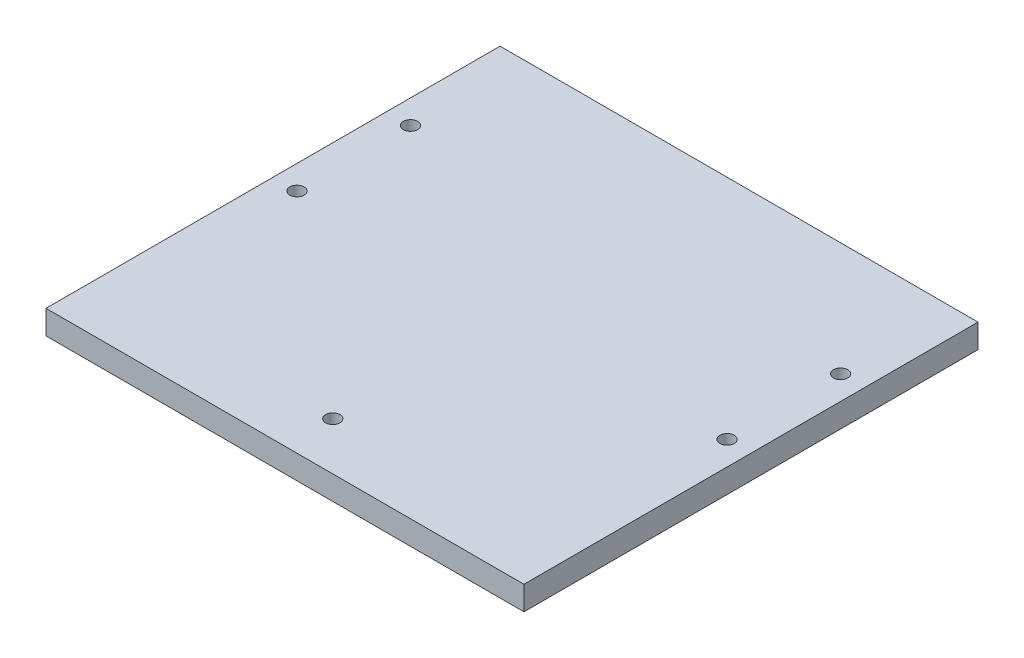
ISO-10303-21;
HEADER;
FILE_DESCRIPTION(('STEP AP214'),'2;1');
FILE_NAME('part.step','',(''),(''),'','','');
FILE_SCHEMA(('AUTOMOTIVE_DESIGN { 1 0 10303 214 1 1 1 1 }'));
ENDSEC;
DATA;
#1=APPLICATION_CONTEXT('core data for automotive mechanical design processes');
#2=APPLICATION_PROTOCOL_DEFINITION('international standard','automotive_design',2000,#1);
#3=PRODUCT_CONTEXT('',#1,'mechanical');
#4=PRODUCT('Part','Part','',(#3));
#5=PRODUCT_RELATED_PRODUCT_CATEGORY('part','',(#4));
#6=PRODUCT_DEFINITION_FORMATION('','',#4);
#7=PRODUCT_DEFINITION_CONTEXT('part definition',#1,'design');
#8=PRODUCT_DEFINITION('design','',#6,#7);
#9=PRODUCT_DEFINITION_SHAPE('','',#8);
#10=(LENGTH_UNIT() NAMED_UNIT(*) SI_UNIT(.MILLI.,.METRE.));
#11=(NAMED_UNIT(*) PLANE_ANGLE_UNIT() SI_UNIT($,.RADIAN.));
#12=(NAMED_UNIT(*) SI_UNIT($,.STERADIAN.) SOLID_ANGLE_UNIT());
#13=UNCERTAINTY_MEASURE_WITH_UNIT(LENGTH_MEASURE(1.E-05),#10,'distance_accuracy_value','');
#14=(GEOMETRIC_REPRESENTATION_CONTEXT(3) GLOBAL_UNCERTAINTY_ASSIGNED_CONTEXT((#13)) GLOBAL_UNIT_ASSIGNED_CONTEXT((#10,
#11,#12)) REPRESENTATION_CONTEXT('',''));
#15=CARTESIAN_POINT('',(0.,0.,0.));
#16=DIRECTION('',(0.,0.,1.));
#17=DIRECTION('',(1.,0.,0.));
#18=AXIS2_PLACEMENT_3D('',#15,#16,#17);
#19=CARTESIAN_POINT('',(0.,10.,-190.));
#20=DIRECTION('',(0.,0.,1.));
#21=DIRECTION('',(1.,0.,0.));
#22=AXIS2_PLACEMENT_3D('',#19,#20,#21);
#23=PLANE('',#22);
#24=DIRECTION('',(1.,0.,0.));
#25=VECTOR('',#24,1.);
#26=CARTESIAN_POINT('',(62.,2.,-190.));
#27=LINE('',#26,#25);
#28=CARTESIAN_POINT('',(62.,2.,-190.));
#29=VERTEX_POINT('',#28);
#30=CARTESIAN_POINT('',(82.,2.,-190.));
#31=VERTEX_POINT('',#30);
#32=EDGE_CURVE('E57',#29,#31,#27,.T.);
#33=ORIENTED_EDGE('',*,*,#32,.T.);
#34=DIRECTION('',(0.,-1.,0.));
#35=VECTOR('',#34,1.);
#36=CARTESIAN_POINT('',(82.,9.,-190.));
#37=LINE('',#36,#35);
#38=CARTESIAN_POINT('',(82.,9.,-190.));
#39=VERTEX_POINT('',#38);
#40=EDGE_CURVE('E229',#39,#31,#37,.T.);
#41=ORIENTED_EDGE('',*,*,#40,.F.);
#42=DIRECTION('',(1.,0.,0.));
#43=VECTOR('',#42,1.);
#44=CARTESIAN_POINT('',(62.,9.,-190.));
#45=LINE('',#44,#43);
#46=CARTESIAN_POINT('',(62.,9.,-190.));
#47=VERTEX_POINT('',#46);
#48=EDGE_CURVE('E225',#47,#39,#45,.T.);
#49=ORIENTED_EDGE('',*,*,#48,.F.);
#50=DIRECTION('',(0.,-1.,0.));
#51=VECTOR('',#50,1.);
#52=CARTESIAN_POINT('',(62.,9.,-190.));
#53=LINE('',#52,#51);
#54=EDGE_CURVE('E222',#47,#29,#53,.T.);
#55=ORIENTED_EDGE('',*,*,#54,.T.);
#56=EDGE_LOOP('',(#33,#41,#49,#55));
#57=FACE_BOUND('',#56,.T.);
#58=DIRECTION('',(-1.,0.,0.));
#59=VECTOR('',#58,1.);
#60=CARTESIAN_POINT('',(138.,2.,-190.));
#61=LINE('',#60,#59);
#62=CARTESIAN_POINT('',(138.,2.,-190.));
#63=VERTEX_POINT('',#62);
#64=CARTESIAN_POINT('',(118.,2.,-190.));
#65=VERTEX_POINT('',#64);
#66=EDGE_CURVE('E259',#63,#65,#61,.T.);
#67=ORIENTED_EDGE('',*,*,#66,.F.);
#68=DIRECTION('',(0.,-1.,0.));
#69=VECTOR('',#68,1.);
#70=CARTESIAN_POINT('',(138.,8.99999999999999,-190.));
#71=LINE('',#70,#69);
#72=CARTESIAN_POINT('',(138.,8.99999999999999,-190.));
#73=VERTEX_POINT('',#72);
#74=EDGE_CURVE('E215',#73,#63,#71,.T.);
#75=ORIENTED_EDGE('',*,*,#74,.F.);
#76=DIRECTION('',(-1.,0.,0.));
#77=VECTOR('',#76,1.);
#78=CARTESIAN_POINT('',(138.,8.99999999999999,-190.));
#79=LINE('',#78,#77);
#80=CARTESIAN_POINT('',(118.,9.,-190.));
#81=VERTEX_POINT('',#80);
#82=EDGE_CURVE('E252',#73,#81,#79,.T.);
#83=ORIENTED_EDGE('',*,*,#82,.T.);
#84=DIRECTION('',(0.,-1.,0.));
#85=VECTOR('',#84,1.);
#86=CARTESIAN_POINT('',(118.,9.,-190.));
#87=LINE('',#86,#85);
#88=EDGE_CURVE('E255',#81,#65,#87,.T.);
#89=ORIENTED_EDGE('',*,*,#88,.T.);
#90=EDGE_LOOP('',(#67,#75,#83,#89));
#91=FACE_BOUND('',#90,.T.);
#92=DIRECTION('',(-1.,0.,0.));
#93=VECTOR('',#92,1.);
#94=CARTESIAN_POINT('',(178.,1.99999999999998,-190.));
#95=LINE('',#94,#93);
#96=CARTESIAN_POINT('',(178.,1.99999999999998,-190.));
#97=VERTEX_POINT('',#96);
#98=CARTESIAN_POINT('',(162.,1.99999999999999,-190.));
#99=VERTEX_POINT('',#98);
#100=EDGE_CURVE('E289',#97,#99,#95,.T.);
#101=ORIENTED_EDGE('',*,*,#100,.F.);
#102=DIRECTION('',(0.,-1.,0.));
#103=VECTOR('',#102,1.);
#104=CARTESIAN_POINT('',(178.,7.99999999999999,-190.));
#105=LINE('',#104,#103);
#106=CARTESIAN_POINT('',(178.,7.99999999999999,-190.));
#107=VERTEX_POINT('',#106);
#108=EDGE_CURVE('E251',#107,#97,#105,.T.);
#109=ORIENTED_EDGE('',*,*,#108,.F.);
#110=DIRECTION('',(-1.,0.,0.));
#111=VECTOR('',#110,1.);
#112=CARTESIAN_POINT('',(178.,7.99999999999999,-190.));
#113=LINE('',#112,#111);
#114=CARTESIAN_POINT('',(162.,8.,-190.));
#115=VERTEX_POINT('',#114);
#116=EDGE_CURVE('E282',#107,#115,#113,.T.);
#117=ORIENTED_EDGE('',*,*,#116,.T.);
#118=DIRECTION('',(0.,-1.,0.));
#119=VECTOR('',#118,1.);
#120=CARTESIAN_POINT('',(162.,8.,-190.));
#121=LINE('',#120,#119);
#122=EDGE_CURVE('E285',#115,#99,#121,.T.);
#123=ORIENTED_EDGE('',*,*,#122,.T.);
#124=EDGE_LOOP('',(#101,#109,#117,#123));
#125=FACE_BOUND('',#124,.T.);
#126=DIRECTION('',(-1.,0.,0.));
#127=VECTOR('',#126,1.);
#128=CARTESIAN_POINT('',(0.,0.,-190.));
#129=LINE('',#128,#127);
#130=CARTESIAN_POINT('',(200.,0.,-190.));
#131=VERTEX_POINT('',#130);
#132=CARTESIAN_POINT('',(0.,0.,-190.));
#133=VERTEX_POINT('',#132);
#134=EDGE_CURVE('E305',#131,#133,#129,.T.);
#135=ORIENTED_EDGE('',*,*,#134,.T.);
#136=DIRECTION('',(0.,-1.,0.));
#137=VECTOR('',#136,1.);
#138=CARTESIAN_POINT('',(0.,10.,-190.));
#139=LINE('',#138,#137);
#140=CARTESIAN_POINT('',(0.,10.,-190.));
#141=VERTEX_POINT('',#140);
#142=EDGE_CURVE('E311',#141,#133,#139,.T.);
#143=ORIENTED_EDGE('',*,*,#142,.F.);
#144=DIRECTION('',(-1.,0.,0.));
#145=VECTOR('',#144,1.);
#146=CARTESIAN_POINT('',(0.,10.,-190.));
#147=LINE('',#146,#145);
#148=CARTESIAN_POINT('',(200.,10.,-190.));
#149=VERTEX_POINT('',#148);
#150=EDGE_CURVE('E309',#149,#141,#147,.T.);
#151=ORIENTED_EDGE('',*,*,#150,.F.);
#152=DIRECTION('',(0.,-1.,0.));
#153=VECTOR('',#152,1.);
#154=CARTESIAN_POINT('',(200.,10.,-190.));
#155=LINE('',#154,#153);
#156=EDGE_CURVE('E321',#149,#131,#155,.T.);
#157=ORIENTED_EDGE('',*,*,#156,.T.);
#158=EDGE_LOOP('',(#135,#143,#151,#157));
#159=FACE_BOUND('',#158,.T.);
#160=DIRECTION('',(1.,0.,0.));
#161=VECTOR('',#160,1.);
#162=CARTESIAN_POINT('',(22.,2.,-190.));
#163=LINE('',#162,#161);
#164=CARTESIAN_POINT('',(22.,2.,-190.));
#165=VERTEX_POINT('',#164);
#166=CARTESIAN_POINT('',(38.,2.,-190.));
#167=VERTEX_POINT('',#166);
#168=EDGE_CURVE('E49',#165,#167,#163,.T.);
#169=ORIENTED_EDGE('',*,*,#168,.T.);
#170=DIRECTION('',(0.,-1.,0.));
#171=VECTOR('',#170,1.);
#172=CARTESIAN_POINT('',(38.,8.00000000000001,-190.));
#173=LINE('',#172,#171);
#174=CARTESIAN_POINT('',(38.,8.00000000000001,-190.));
#175=VERTEX_POINT('',#174);
#176=EDGE_CURVE('E188',#175,#167,#173,.T.);
#177=ORIENTED_EDGE('',*,*,#176,.F.);
#178=DIRECTION('',(1.,0.,0.));
#179=VECTOR('',#178,1.);
#180=CARTESIAN_POINT('',(22.,8.00000000000001,-190.));
#181=LINE('',#180,#179);
#182=CARTESIAN_POINT('',(22.,8.00000000000001,-190.));
#183=VERTEX_POINT('',#182);
#184=EDGE_CURVE('E203',#183,#175,#181,.T.);
#185=ORIENTED_EDGE('',*,*,#184,.F.);
#186=DIRECTION('',(0.,-1.,0.));
#187=VECTOR('',#186,1.);
#188=CARTESIAN_POINT('',(22.,8.00000000000001,-190.));
#189=LINE('',#188,#187);
#190=EDGE_CURVE('E181',#183,#165,#189,.T.);
#191=ORIENTED_EDGE('',*,*,#190,.T.);
#192=EDGE_LOOP('',(#169,#177,#185,#191));
#193=FACE_BOUND('',#192,.T.);
#194=ADVANCED_FACE('F34',(#57,#91,#125,#159,#193),#23,.F.);
#195=CARTESIAN_POINT('',(0.,10.,0.));
#196=DIRECTION('',(1.,0.,0.));
#197=DIRECTION('',(0.,0.,-1.));
#198=AXIS2_PLACEMENT_3D('',#195,#196,#197);
#199=PLANE('',#198);
#200=DIRECTION('',(0.,0.,1.));
#201=VECTOR('',#200,1.);
#202=CARTESIAN_POINT('',(0.,0.,0.));
#203=LINE('',#202,#201);
#204=CARTESIAN_POINT('',(0.,0.,0.));
#205=VERTEX_POINT('',#204);
#206=EDGE_CURVE('E189',#133,#205,#203,.T.);
#207=ORIENTED_EDGE('',*,*,#206,.T.);
#208=DIRECTION('',(0.,-1.,0.));
#209=VECTOR('',#208,1.);
#210=CARTESIAN_POINT('',(0.,10.,0.));
#211=LINE('',#210,#209);
#212=CARTESIAN_POINT('',(0.,10.,0.));
#213=VERTEX_POINT('',#212);
#214=EDGE_CURVE('E11',#213,#205,#211,.T.);
#215=ORIENTED_EDGE('',*,*,#214,.F.);
#216=DIRECTION('',(0.,0.,1.));
#217=VECTOR('',#216,1.);
#218=CARTESIAN_POINT('',(0.,10.,0.));
#219=LINE('',#218,#217);
#220=EDGE_CURVE('E301',#141,#213,#219,.T.);
#221=ORIENTED_EDGE('',*,*,#220,.F.);
#222=ORIENTED_EDGE('',*,*,#142,.T.);
#223=EDGE_LOOP('',(#207,#215,#221,#222));
#224=FACE_BOUND('',#223,.T.);
#225=ADVANCED_FACE('F36',(#224),#199,.F.);
#226=CARTESIAN_POINT('',(0.,10.,0.));
#227=DIRECTION('',(0.,0.,-1.));
#228=DIRECTION('',(-1.,0.,0.));
#229=AXIS2_PLACEMENT_3D('',#226,#227,#228);
#230=PLANE('',#229);
#231=DIRECTION('',(1.,0.,0.));
#232=VECTOR('',#231,1.);
#233=CARTESIAN_POINT('',(0.,0.,0.));
#234=LINE('',#233,#232);
#235=CARTESIAN_POINT('',(200.,0.,0.));
#236=VERTEX_POINT('',#235);
#237=EDGE_CURVE('E314',#205,#236,#234,.T.);
#238=ORIENTED_EDGE('',*,*,#237,.T.);
#239=DIRECTION('',(0.,-1.,0.));
#240=VECTOR('',#239,1.);
#241=CARTESIAN_POINT('',(200.,10.,0.));
#242=LINE('',#241,#240);
#243=CARTESIAN_POINT('',(200.,10.,0.));
#244=VERTEX_POINT('',#243);
#245=EDGE_CURVE('E42',#244,#236,#242,.T.);
#246=ORIENTED_EDGE('',*,*,#245,.F.);
#247=DIRECTION('',(1.,0.,0.));
#248=VECTOR('',#247,1.);
#249=CARTESIAN_POINT('',(0.,10.,0.));
#250=LINE('',#249,#248);
#251=EDGE_CURVE('E304',#213,#244,#250,.T.);
#252=ORIENTED_EDGE('',*,*,#251,.F.);
#253=ORIENTED_EDGE('',*,*,#214,.T.);
#254=EDGE_LOOP('',(#238,#246,#252,#253));
#255=FACE_BOUND('',#254,.T.);
#256=ADVANCED_FACE('F344',(#255),#230,.F.);
#257=CARTESIAN_POINT('',(200.,10.,0.));
#258=DIRECTION('',(-1.,0.,0.));
#259=DIRECTION('',(0.,0.,1.));
#260=AXIS2_PLACEMENT_3D('',#257,#258,#259);
#261=PLANE('',#260);
#262=DIRECTION('',(0.,0.,-1.));
#263=VECTOR('',#262,1.);
#264=CARTESIAN_POINT('',(200.,0.,0.));
#265=LINE('',#264,#263);
#266=EDGE_CURVE('E316',#236,#131,#265,.T.);
#267=ORIENTED_EDGE('',*,*,#266,.T.);
#268=ORIENTED_EDGE('',*,*,#156,.F.);
#269=DIRECTION('',(0.,0.,-1.));
#270=VECTOR('',#269,1.);
#271=CARTESIAN_POINT('',(200.,10.,0.));
#272=LINE('',#271,#270);
#273=EDGE_CURVE('E307',#244,#149,#272,.T.);
#274=ORIENTED_EDGE('',*,*,#273,.F.);
#275=ORIENTED_EDGE('',*,*,#245,.T.);
#276=EDGE_LOOP('',(#267,#268,#274,#275));
#277=FACE_BOUND('',#276,.T.);
#278=ADVANCED_FACE('F328',(#277),#261,.F.);
#279=CARTESIAN_POINT('',(0.,10.,0.));
#280=DIRECTION('',(0.,-1.,0.));
#281=DIRECTION('',(0.,0.,-1.));
#282=AXIS2_PLACEMENT_3D('',#279,#280,#281);
#283=PLANE('',#282);
#284=CARTESIAN_POINT('',(100.,10.,-20.));
#285=DIRECTION('',(0.,1.,0.));
#286=DIRECTION('',(0.,0.,1.));
#287=AXIS2_PLACEMENT_3D('',#284,#285,#286);
#288=CIRCLE('',#287,3.00000000000001);
#289=CARTESIAN_POINT('',(100.,10.,-17.));
#290=VERTEX_POINT('',#289);
#291=EDGE_CURVE('E464',#290,#290,#288,.T.);
#292=ORIENTED_EDGE('',*,*,#291,.F.);
#293=EDGE_LOOP('',(#292));
#294=FACE_BOUND('',#293,.T.);
#295=CARTESIAN_POINT('',(190.,10.,-142.5));
#296=DIRECTION('',(0.,-1.,0.));
#297=DIRECTION('',(0.,0.,1.));
#298=AXIS2_PLACEMENT_3D('',#295,#296,#297);
#299=CIRCLE('',#298,2.99999999999997);
#300=CARTESIAN_POINT('',(190.,10.,-139.5));
#301=VERTEX_POINT('',#300);
#302=EDGE_CURVE('E482',#301,#301,#299,.T.);
#303=ORIENTED_EDGE('',*,*,#302,.T.);
#304=EDGE_LOOP('',(#303));
#305=FACE_BOUND('',#304,.T.);
#306=CARTESIAN_POINT('',(190.,10.,-95.));
#307=DIRECTION('',(0.,-1.,0.));
#308=DIRECTION('',(0.,0.,1.));
#309=AXIS2_PLACEMENT_3D('',#306,#307,#308);
#310=CIRCLE('',#309,2.99999999999996);
#311=CARTESIAN_POINT('',(190.,10.,-92.));
#312=VERTEX_POINT('',#311);
#313=EDGE_CURVE('E476',#312,#312,#310,.T.);
#314=ORIENTED_EDGE('',*,*,#313,.T.);
#315=EDGE_LOOP('',(#314));
#316=FACE_BOUND('',#315,.T.);
#317=CARTESIAN_POINT('',(10.,10.,-95.));
#318=DIRECTION('',(0.,-1.,0.));
#319=DIRECTION('',(0.,0.,-1.));
#320=AXIS2_PLACEMENT_3D('',#317,#318,#319);
#321=CIRCLE('',#320,3.);
#322=CARTESIAN_POINT('',(10.,10.,-98.));
#323=VERTEX_POINT('',#322);
#324=EDGE_CURVE('E469',#323,#323,#321,.T.);
#325=ORIENTED_EDGE('',*,*,#324,.T.);
#326=EDGE_LOOP('',(#325));
#327=FACE_BOUND('',#326,.T.);
#328=CARTESIAN_POINT('',(10.,10.,-142.5));
#329=DIRECTION('',(0.,-1.,0.));
#330=DIRECTION('',(0.,0.,-1.));
#331=AXIS2_PLACEMENT_3D('',#328,#329,#330);
#332=CIRCLE('',#331,3.);
#333=CARTESIAN_POINT('',(10.,10.,-145.5));
#334=VERTEX_POINT('',#333);
#335=EDGE_CURVE('E281',#334,#334,#332,.T.);
#336=ORIENTED_EDGE('',*,*,#335,.T.);
#337=EDGE_LOOP('',(#336));
#338=FACE_BOUND('',#337,.T.);
#339=ORIENTED_EDGE('',*,*,#220,.T.);
#340=ORIENTED_EDGE('',*,*,#251,.T.);
#341=ORIENTED_EDGE('',*,*,#273,.T.);
#342=ORIENTED_EDGE('',*,*,#150,.T.);
#343=EDGE_LOOP('',(#339,#340,#341,#342));
#344=FACE_BOUND('',#343,.T.);
#345=ADVANCED_FACE('F343',(#294,#305,#316,#327,#338,#344),#283,.F.);
#346=CARTESIAN_POINT('',(0.,0.,0.));
#347=DIRECTION('',(0.,-1.,0.));
#348=DIRECTION('',(0.,0.,-1.));
#349=AXIS2_PLACEMENT_3D('',#346,#347,#348);
#350=PLANE('',#349);
#351=CARTESIAN_POINT('',(100.,0.,-20.));
#352=DIRECTION('',(0.,1.,0.));
#353=DIRECTION('',(0.,0.,1.));
#354=AXIS2_PLACEMENT_3D('',#351,#352,#353);
#355=CIRCLE('',#354,3.00000000000001);
#356=CARTESIAN_POINT('',(100.,0.,-17.));
#357=VERTEX_POINT('',#356);
#358=EDGE_CURVE('E461',#357,#357,#355,.T.);
#359=ORIENTED_EDGE('',*,*,#358,.T.);
#360=EDGE_LOOP('',(#359));
#361=FACE_BOUND('',#360,.T.);
#362=CARTESIAN_POINT('',(190.,0.,-142.5));
#363=DIRECTION('',(0.,-1.,0.));
#364=DIRECTION('',(0.,0.,1.));
#365=AXIS2_PLACEMENT_3D('',#362,#363,#364);
#366=CIRCLE('',#365,2.99999999999997);
#367=CARTESIAN_POINT('',(190.,0.,-139.5));
#368=VERTEX_POINT('',#367);
#369=EDGE_CURVE('E466',#368,#368,#366,.T.);
#370=ORIENTED_EDGE('',*,*,#369,.F.);
#371=EDGE_LOOP('',(#370));
#372=FACE_BOUND('',#371,.T.);
#373=CARTESIAN_POINT('',(190.,0.,-95.));
#374=DIRECTION('',(0.,-1.,0.));
#375=DIRECTION('',(0.,0.,1.));
#376=AXIS2_PLACEMENT_3D('',#373,#374,#375);
#377=CIRCLE('',#376,2.99999999999996);
#378=CARTESIAN_POINT('',(190.,0.,-92.));
#379=VERTEX_POINT('',#378);
#380=EDGE_CURVE('E479',#379,#379,#377,.T.);
#381=ORIENTED_EDGE('',*,*,#380,.F.);
#382=EDGE_LOOP('',(#381));
#383=FACE_BOUND('',#382,.T.);
#384=CARTESIAN_POINT('',(10.,0.,-95.));
#385=DIRECTION('',(0.,-1.,0.));
#386=DIRECTION('',(0.,0.,-1.));
#387=AXIS2_PLACEMENT_3D('',#384,#385,#386);
#388=CIRCLE('',#387,3.);
#389=CARTESIAN_POINT('',(10.,0.,-98.));
#390=VERTEX_POINT('',#389);
#391=EDGE_CURVE('E473',#390,#390,#388,.T.);
#392=ORIENTED_EDGE('',*,*,#391,.F.);
#393=EDGE_LOOP('',(#392));
#394=FACE_BOUND('',#393,.T.);
#395=CARTESIAN_POINT('',(10.,0.,-142.5));
#396=DIRECTION('',(0.,-1.,0.));
#397=DIRECTION('',(0.,0.,-1.));
#398=AXIS2_PLACEMENT_3D('',#395,#396,#397);
#399=CIRCLE('',#398,3.);
#400=CARTESIAN_POINT('',(10.,0.,-145.5));
#401=VERTEX_POINT('',#400);
#402=EDGE_CURVE('E472',#401,#401,#399,.T.);
#403=ORIENTED_EDGE('',*,*,#402,.F.);
#404=EDGE_LOOP('',(#403));
#405=FACE_BOUND('',#404,.T.);
#406=ORIENTED_EDGE('',*,*,#206,.F.);
#407=ORIENTED_EDGE('',*,*,#134,.F.);
#408=ORIENTED_EDGE('',*,*,#266,.F.);
#409=ORIENTED_EDGE('',*,*,#237,.F.);
#410=EDGE_LOOP('',(#406,#407,#408,#409));
#411=FACE_BOUND('',#410,.T.);
#412=ADVANCED_FACE('F334',(#361,#372,#383,#394,#405,#411),#350,.T.);
#413=CARTESIAN_POINT('',(178.,7.99999999999999,-180.));
#414=DIRECTION('',(1.,0.,0.));
#415=DIRECTION('',(0.,0.,-1.));
#416=AXIS2_PLACEMENT_3D('',#413,#414,#415);
#417=PLANE('',#416);
#418=ORIENTED_EDGE('',*,*,#108,.T.);
#419=DIRECTION('',(0.,0.,-1.));
#420=VECTOR('',#419,1.);
#421=CARTESIAN_POINT('',(178.,1.99999999999998,-180.));
#422=LINE('',#421,#420);
#423=CARTESIAN_POINT('',(178.,1.99999999999998,-180.));
#424=VERTEX_POINT('',#423);
#425=EDGE_CURVE('E271',#424,#97,#422,.T.);
#426=ORIENTED_EDGE('',*,*,#425,.F.);
#427=DIRECTION('',(0.,-1.,0.));
#428=VECTOR('',#427,1.);
#429=CARTESIAN_POINT('',(178.,7.99999999999999,-180.));
#430=LINE('',#429,#428);
#431=CARTESIAN_POINT('',(178.,7.99999999999999,-180.));
#432=VERTEX_POINT('',#431);
#433=EDGE_CURVE('E286',#432,#424,#430,.T.);
#434=ORIENTED_EDGE('',*,*,#433,.F.);
#435=DIRECTION('',(0.,0.,-1.));
#436=VECTOR('',#435,1.);
#437=CARTESIAN_POINT('',(178.,7.99999999999999,-180.));
#438=LINE('',#437,#436);
#439=EDGE_CURVE('E279',#432,#107,#438,.T.);
#440=ORIENTED_EDGE('',*,*,#439,.T.);
#441=EDGE_LOOP('',(#418,#426,#434,#440));
#442=FACE_BOUND('',#441,.T.);
#443=ADVANCED_FACE('F360',(#442),#417,.F.);
#444=CARTESIAN_POINT('',(178.,7.99999999999999,-180.));
#445=DIRECTION('',(0.,-1.,0.));
#446=DIRECTION('',(1.,0.,0.));
#447=AXIS2_PLACEMENT_3D('',#444,#445,#446);
#448=PLANE('',#447);
#449=ORIENTED_EDGE('',*,*,#116,.F.);
#450=ORIENTED_EDGE('',*,*,#439,.F.);
#451=DIRECTION('',(-1.,0.,0.));
#452=VECTOR('',#451,1.);
#453=CARTESIAN_POINT('',(178.,7.99999999999999,-180.));
#454=LINE('',#453,#452);
#455=CARTESIAN_POINT('',(162.,8.,-180.));
#456=VERTEX_POINT('',#455);
#457=EDGE_CURVE('E274',#432,#456,#454,.T.);
#458=ORIENTED_EDGE('',*,*,#457,.T.);
#459=DIRECTION('',(0.,0.,-1.));
#460=VECTOR('',#459,1.);
#461=CARTESIAN_POINT('',(162.,8.,-180.));
#462=LINE('',#461,#460);
#463=EDGE_CURVE('E277',#456,#115,#462,.T.);
#464=ORIENTED_EDGE('',*,*,#463,.T.);
#465=EDGE_LOOP('',(#449,#450,#458,#464));
#466=FACE_BOUND('',#465,.T.);
#467=ADVANCED_FACE('F371',(#466),#448,.T.);
#468=CARTESIAN_POINT('',(162.,8.,-180.));
#469=DIRECTION('',(1.,0.,0.));
#470=DIRECTION('',(0.,0.,-1.));
#471=AXIS2_PLACEMENT_3D('',#468,#469,#470);
#472=PLANE('',#471);
#473=ORIENTED_EDGE('',*,*,#122,.F.);
#474=ORIENTED_EDGE('',*,*,#463,.F.);
#475=DIRECTION('',(0.,-1.,0.));
#476=VECTOR('',#475,1.);
#477=CARTESIAN_POINT('',(162.,8.,-180.));
#478=LINE('',#477,#476);
#479=CARTESIAN_POINT('',(162.,1.99999999999999,-180.));
#480=VERTEX_POINT('',#479);
#481=EDGE_CURVE('E294',#456,#480,#478,.T.);
#482=ORIENTED_EDGE('',*,*,#481,.T.);
#483=DIRECTION('',(0.,0.,-1.));
#484=VECTOR('',#483,1.);
#485=CARTESIAN_POINT('',(162.,1.99999999999999,-180.));
#486=LINE('',#485,#484);
#487=EDGE_CURVE('E275',#480,#99,#486,.T.);
#488=ORIENTED_EDGE('',*,*,#487,.T.);
#489=EDGE_LOOP('',(#473,#474,#482,#488));
#490=FACE_BOUND('',#489,.T.);
#491=ADVANCED_FACE('F374',(#490),#472,.T.);
#492=CARTESIAN_POINT('',(178.,1.99999999999998,-180.));
#493=DIRECTION('',(0.,-1.,0.));
#494=DIRECTION('',(1.,0.,0.));
#495=AXIS2_PLACEMENT_3D('',#492,#493,#494);
#496=PLANE('',#495);
#497=ORIENTED_EDGE('',*,*,#100,.T.);
#498=ORIENTED_EDGE('',*,*,#487,.F.);
#499=DIRECTION('',(-1.,0.,0.));
#500=VECTOR('',#499,1.);
#501=CARTESIAN_POINT('',(178.,1.99999999999998,-180.));
#502=LINE('',#501,#500);
#503=EDGE_CURVE('E296',#424,#480,#502,.T.);
#504=ORIENTED_EDGE('',*,*,#503,.F.);
#505=ORIENTED_EDGE('',*,*,#425,.T.);
#506=EDGE_LOOP('',(#497,#498,#504,#505));
#507=FACE_BOUND('',#506,.T.);
#508=ADVANCED_FACE('F369',(#507),#496,.F.);
#509=CARTESIAN_POINT('',(0.,0.,-180.));
#510=DIRECTION('',(0.,0.,-1.));
#511=DIRECTION('',(-1.,0.,0.));
#512=AXIS2_PLACEMENT_3D('',#509,#510,#511);
#513=PLANE('',#512);
#514=ORIENTED_EDGE('',*,*,#433,.T.);
#515=ORIENTED_EDGE('',*,*,#503,.T.);
#516=ORIENTED_EDGE('',*,*,#481,.F.);
#517=ORIENTED_EDGE('',*,*,#457,.F.);
#518=EDGE_LOOP('',(#514,#515,#516,#517));
#519=FACE_BOUND('',#518,.T.);
#520=ADVANCED_FACE('F365',(#519),#513,.T.);
#521=CARTESIAN_POINT('',(138.,8.99999999999999,-180.));
#522=DIRECTION('',(1.,0.,0.));
#523=DIRECTION('',(0.,0.,-1.));
#524=AXIS2_PLACEMENT_3D('',#521,#522,#523);
#525=PLANE('',#524);
#526=ORIENTED_EDGE('',*,*,#74,.T.);
#527=DIRECTION('',(0.,0.,-1.));
#528=VECTOR('',#527,1.);
#529=CARTESIAN_POINT('',(138.,2.,-180.));
#530=LINE('',#529,#528);
#531=CARTESIAN_POINT('',(138.,2.,-180.));
#532=VERTEX_POINT('',#531);
#533=EDGE_CURVE('E241',#532,#63,#530,.T.);
#534=ORIENTED_EDGE('',*,*,#533,.F.);
#535=DIRECTION('',(0.,-1.,0.));
#536=VECTOR('',#535,1.);
#537=CARTESIAN_POINT('',(138.,8.99999999999999,-180.));
#538=LINE('',#537,#536);
#539=CARTESIAN_POINT('',(138.,8.99999999999999,-180.));
#540=VERTEX_POINT('',#539);
#541=EDGE_CURVE('E256',#540,#532,#538,.T.);
#542=ORIENTED_EDGE('',*,*,#541,.F.);
#543=DIRECTION('',(0.,0.,-1.));
#544=VECTOR('',#543,1.);
#545=CARTESIAN_POINT('',(138.,8.99999999999999,-180.));
#546=LINE('',#545,#544);
#547=EDGE_CURVE('E249',#540,#73,#546,.T.);
#548=ORIENTED_EDGE('',*,*,#547,.T.);
#549=EDGE_LOOP('',(#526,#534,#542,#548));
#550=FACE_BOUND('',#549,.T.);
#551=ADVANCED_FACE('F368',(#550),#525,.F.);
#552=CARTESIAN_POINT('',(138.,8.99999999999999,-180.));
#553=DIRECTION('',(0.,-1.,0.));
#554=DIRECTION('',(1.,0.,0.));
#555=AXIS2_PLACEMENT_3D('',#552,#553,#554);
#556=PLANE('',#555);
#557=ORIENTED_EDGE('',*,*,#82,.F.);
#558=ORIENTED_EDGE('',*,*,#547,.F.);
#559=DIRECTION('',(-1.,0.,0.));
#560=VECTOR('',#559,1.);
#561=CARTESIAN_POINT('',(138.,8.99999999999999,-180.));
#562=LINE('',#561,#560);
#563=CARTESIAN_POINT('',(118.,9.,-180.));
#564=VERTEX_POINT('',#563);
#565=EDGE_CURVE('E244',#540,#564,#562,.T.);
#566=ORIENTED_EDGE('',*,*,#565,.T.);
#567=DIRECTION('',(0.,0.,-1.));
#568=VECTOR('',#567,1.);
#569=CARTESIAN_POINT('',(118.,9.,-180.));
#570=LINE('',#569,#568);
#571=EDGE_CURVE('E247',#564,#81,#570,.T.);
#572=ORIENTED_EDGE('',*,*,#571,.T.);
#573=EDGE_LOOP('',(#557,#558,#566,#572));
#574=FACE_BOUND('',#573,.T.);
#575=ADVANCED_FACE('F391',(#574),#556,.T.);
#576=CARTESIAN_POINT('',(118.,9.,-180.));
#577=DIRECTION('',(1.,0.,0.));
#578=DIRECTION('',(0.,0.,-1.));
#579=AXIS2_PLACEMENT_3D('',#576,#577,#578);
#580=PLANE('',#579);
#581=ORIENTED_EDGE('',*,*,#88,.F.);
#582=ORIENTED_EDGE('',*,*,#571,.F.);
#583=DIRECTION('',(0.,-1.,0.));
#584=VECTOR('',#583,1.);
#585=CARTESIAN_POINT('',(118.,9.,-180.));
#586=LINE('',#585,#584);
#587=CARTESIAN_POINT('',(118.,2.,-180.));
#588=VERTEX_POINT('',#587);
#589=EDGE_CURVE('E264',#564,#588,#586,.T.);
#590=ORIENTED_EDGE('',*,*,#589,.T.);
#591=DIRECTION('',(0.,0.,-1.));
#592=VECTOR('',#591,1.);
#593=CARTESIAN_POINT('',(118.,2.,-180.));
#594=LINE('',#593,#592);
#595=EDGE_CURVE('E245',#588,#65,#594,.T.);
#596=ORIENTED_EDGE('',*,*,#595,.T.);
#597=EDGE_LOOP('',(#581,#582,#590,#596));
#598=FACE_BOUND('',#597,.T.);
#599=ADVANCED_FACE('F394',(#598),#580,.T.);
#600=CARTESIAN_POINT('',(138.,2.,-180.));
#601=DIRECTION('',(0.,-1.,0.));
#602=DIRECTION('',(1.,0.,0.));
#603=AXIS2_PLACEMENT_3D('',#600,#601,#602);
#604=PLANE('',#603);
#605=ORIENTED_EDGE('',*,*,#66,.T.);
#606=ORIENTED_EDGE('',*,*,#595,.F.);
#607=DIRECTION('',(-1.,0.,0.));
#608=VECTOR('',#607,1.);
#609=CARTESIAN_POINT('',(138.,2.,-180.));
#610=LINE('',#609,#608);
#611=EDGE_CURVE('E266',#532,#588,#610,.T.);
#612=ORIENTED_EDGE('',*,*,#611,.F.);
#613=ORIENTED_EDGE('',*,*,#533,.T.);
#614=EDGE_LOOP('',(#605,#606,#612,#613));
#615=FACE_BOUND('',#614,.T.);
#616=ADVANCED_FACE('F389',(#615),#604,.F.);
#617=CARTESIAN_POINT('',(0.,0.,-180.));
#618=DIRECTION('',(0.,0.,-1.));
#619=DIRECTION('',(-1.,0.,0.));
#620=AXIS2_PLACEMENT_3D('',#617,#618,#619);
#621=PLANE('',#620);
#622=ORIENTED_EDGE('',*,*,#541,.T.);
#623=ORIENTED_EDGE('',*,*,#611,.T.);
#624=ORIENTED_EDGE('',*,*,#589,.F.);
#625=ORIENTED_EDGE('',*,*,#565,.F.);
#626=EDGE_LOOP('',(#622,#623,#624,#625));
#627=FACE_BOUND('',#626,.T.);
#628=ADVANCED_FACE('F385',(#627),#621,.T.);
#629=CARTESIAN_POINT('',(62.,2.,-180.));
#630=DIRECTION('',(0.,1.,0.));
#631=DIRECTION('',(-1.,0.,0.));
#632=AXIS2_PLACEMENT_3D('',#629,#630,#631);
#633=PLANE('',#632);
#634=ORIENTED_EDGE('',*,*,#32,.F.);
#635=DIRECTION('',(0.,0.,-1.));
#636=VECTOR('',#635,1.);
#637=CARTESIAN_POINT('',(62.,2.,-180.));
#638=LINE('',#637,#636);
#639=CARTESIAN_POINT('',(62.,2.,-180.));
#640=VERTEX_POINT('',#639);
#641=EDGE_CURVE('E219',#640,#29,#638,.T.);
#642=ORIENTED_EDGE('',*,*,#641,.F.);
#643=DIRECTION('',(1.,0.,0.));
#644=VECTOR('',#643,1.);
#645=CARTESIAN_POINT('',(62.,2.,-180.));
#646=LINE('',#645,#644);
#647=CARTESIAN_POINT('',(82.,2.,-180.));
#648=VERTEX_POINT('',#647);
#649=EDGE_CURVE('E226',#640,#648,#646,.T.);
#650=ORIENTED_EDGE('',*,*,#649,.T.);
#651=DIRECTION('',(0.,0.,-1.));
#652=VECTOR('',#651,1.);
#653=CARTESIAN_POINT('',(82.,2.,-180.));
#654=LINE('',#653,#652);
#655=EDGE_CURVE('E212',#648,#31,#654,.T.);
#656=ORIENTED_EDGE('',*,*,#655,.T.);
#657=EDGE_LOOP('',(#634,#642,#650,#656));
#658=FACE_BOUND('',#657,.T.);
#659=ADVANCED_FACE('F388',(#658),#633,.T.);
#660=CARTESIAN_POINT('',(82.,9.,-180.));
#661=DIRECTION('',(1.,0.,0.));
#662=DIRECTION('',(0.,0.,-1.));
#663=AXIS2_PLACEMENT_3D('',#660,#661,#662);
#664=PLANE('',#663);
#665=ORIENTED_EDGE('',*,*,#40,.T.);
#666=ORIENTED_EDGE('',*,*,#655,.F.);
#667=DIRECTION('',(0.,-1.,0.));
#668=VECTOR('',#667,1.);
#669=CARTESIAN_POINT('',(82.,9.,-180.));
#670=LINE('',#669,#668);
#671=CARTESIAN_POINT('',(82.,9.,-180.));
#672=VERTEX_POINT('',#671);
#673=EDGE_CURVE('E237',#672,#648,#670,.T.);
#674=ORIENTED_EDGE('',*,*,#673,.F.);
#675=DIRECTION('',(0.,0.,-1.));
#676=VECTOR('',#675,1.);
#677=CARTESIAN_POINT('',(82.,9.,-180.));
#678=LINE('',#677,#676);
#679=EDGE_CURVE('E214',#672,#39,#678,.T.);
#680=ORIENTED_EDGE('',*,*,#679,.T.);
#681=EDGE_LOOP('',(#665,#666,#674,#680));
#682=FACE_BOUND('',#681,.T.);
#683=ADVANCED_FACE('F416',(#682),#664,.F.);
#684=CARTESIAN_POINT('',(62.,9.,-180.));
#685=DIRECTION('',(0.,1.,0.));
#686=DIRECTION('',(-1.,0.,0.));
#687=AXIS2_PLACEMENT_3D('',#684,#685,#686);
#688=PLANE('',#687);
#689=ORIENTED_EDGE('',*,*,#48,.T.);
#690=ORIENTED_EDGE('',*,*,#679,.F.);
#691=DIRECTION('',(1.,0.,0.));
#692=VECTOR('',#691,1.);
#693=CARTESIAN_POINT('',(62.,9.,-180.));
#694=LINE('',#693,#692);
#695=CARTESIAN_POINT('',(62.,9.,-180.));
#696=VERTEX_POINT('',#695);
#697=EDGE_CURVE('E234',#696,#672,#694,.T.);
#698=ORIENTED_EDGE('',*,*,#697,.F.);
#699=DIRECTION('',(0.,0.,-1.));
#700=VECTOR('',#699,1.);
#701=CARTESIAN_POINT('',(62.,9.,-180.));
#702=LINE('',#701,#700);
#703=EDGE_CURVE('E217',#696,#47,#702,.T.);
#704=ORIENTED_EDGE('',*,*,#703,.T.);
#705=EDGE_LOOP('',(#689,#690,#698,#704));
#706=FACE_BOUND('',#705,.T.);
#707=ADVANCED_FACE('F412',(#706),#688,.F.);
#708=CARTESIAN_POINT('',(62.,9.,-180.));
#709=DIRECTION('',(1.,0.,0.));
#710=DIRECTION('',(0.,0.,-1.));
#711=AXIS2_PLACEMENT_3D('',#708,#709,#710);
#712=PLANE('',#711);
#713=ORIENTED_EDGE('',*,*,#54,.F.);
#714=ORIENTED_EDGE('',*,*,#703,.F.);
#715=DIRECTION('',(0.,-1.,0.));
#716=VECTOR('',#715,1.);
#717=CARTESIAN_POINT('',(62.,9.,-180.));
#718=LINE('',#717,#716);
#719=EDGE_CURVE('E221',#696,#640,#718,.T.);
#720=ORIENTED_EDGE('',*,*,#719,.T.);
#721=ORIENTED_EDGE('',*,*,#641,.T.);
#722=EDGE_LOOP('',(#713,#714,#720,#721));
#723=FACE_BOUND('',#722,.T.);
#724=ADVANCED_FACE('F408',(#723),#712,.T.);
#725=CARTESIAN_POINT('',(0.,0.,-180.));
#726=DIRECTION('',(0.,0.,-1.));
#727=DIRECTION('',(-1.,0.,0.));
#728=AXIS2_PLACEMENT_3D('',#725,#726,#727);
#729=PLANE('',#728);
#730=ORIENTED_EDGE('',*,*,#649,.F.);
#731=ORIENTED_EDGE('',*,*,#719,.F.);
#732=ORIENTED_EDGE('',*,*,#697,.T.);
#733=ORIENTED_EDGE('',*,*,#673,.T.);
#734=EDGE_LOOP('',(#730,#731,#732,#733));
#735=FACE_BOUND('',#734,.T.);
#736=ADVANCED_FACE('F405',(#735),#729,.T.);
#737=CARTESIAN_POINT('',(22.,2.,-180.));
#738=DIRECTION('',(0.,1.,0.));
#739=DIRECTION('',(-1.,0.,0.));
#740=AXIS2_PLACEMENT_3D('',#737,#738,#739);
#741=PLANE('',#740);
#742=ORIENTED_EDGE('',*,*,#168,.F.);
#743=DIRECTION('',(0.,0.,-1.));
#744=VECTOR('',#743,1.);
#745=CARTESIAN_POINT('',(22.,2.,-180.));
#746=LINE('',#745,#744);
#747=CARTESIAN_POINT('',(22.,2.,-180.));
#748=VERTEX_POINT('',#747);
#749=EDGE_CURVE('E176',#748,#165,#746,.T.);
#750=ORIENTED_EDGE('',*,*,#749,.F.);
#751=DIRECTION('',(1.,0.,0.));
#752=VECTOR('',#751,1.);
#753=CARTESIAN_POINT('',(22.,2.,-180.));
#754=LINE('',#753,#752);
#755=CARTESIAN_POINT('',(38.,2.,-180.));
#756=VERTEX_POINT('',#755);
#757=EDGE_CURVE('E171',#748,#756,#754,.T.);
#758=ORIENTED_EDGE('',*,*,#757,.T.);
#759=DIRECTION('',(0.,0.,-1.));
#760=VECTOR('',#759,1.);
#761=CARTESIAN_POINT('',(38.,2.,-180.));
#762=LINE('',#761,#760);
#763=EDGE_CURVE('E174',#756,#167,#762,.T.);
#764=ORIENTED_EDGE('',*,*,#763,.T.);
#765=EDGE_LOOP('',(#742,#750,#758,#764));
#766=FACE_BOUND('',#765,.T.);
#767=ADVANCED_FACE('F173',(#766),#741,.T.);
#768=CARTESIAN_POINT('',(38.,8.00000000000001,-180.));
#769=DIRECTION('',(1.,0.,0.));
#770=DIRECTION('',(0.,0.,-1.));
#771=AXIS2_PLACEMENT_3D('',#768,#769,#770);
#772=PLANE('',#771);
#773=ORIENTED_EDGE('',*,*,#176,.T.);
#774=ORIENTED_EDGE('',*,*,#763,.F.);
#775=DIRECTION('',(0.,-1.,0.));
#776=VECTOR('',#775,1.);
#777=CARTESIAN_POINT('',(38.,8.00000000000001,-180.));
#778=LINE('',#777,#776);
#779=CARTESIAN_POINT('',(38.,8.00000000000001,-180.));
#780=VERTEX_POINT('',#779);
#781=EDGE_CURVE('E180',#780,#756,#778,.T.);
#782=ORIENTED_EDGE('',*,*,#781,.F.);
#783=DIRECTION('',(0.,0.,-1.));
#784=VECTOR('',#783,1.);
#785=CARTESIAN_POINT('',(38.,8.00000000000001,-180.));
#786=LINE('',#785,#784);
#787=EDGE_CURVE('E190',#780,#175,#786,.T.);
#788=ORIENTED_EDGE('',*,*,#787,.T.);
#789=EDGE_LOOP('',(#773,#774,#782,#788));
#790=FACE_BOUND('',#789,.T.);
#791=ADVANCED_FACE('F185',(#790),#772,.F.);
#792=CARTESIAN_POINT('',(22.,8.00000000000001,-180.));
#793=DIRECTION('',(0.,1.,0.));
#794=DIRECTION('',(-1.,0.,0.));
#795=AXIS2_PLACEMENT_3D('',#792,#793,#794);
#796=PLANE('',#795);
#797=ORIENTED_EDGE('',*,*,#184,.T.);
#798=ORIENTED_EDGE('',*,*,#787,.F.);
#799=DIRECTION('',(1.,0.,0.));
#800=VECTOR('',#799,1.);
#801=CARTESIAN_POINT('',(22.,8.00000000000001,-180.));
#802=LINE('',#801,#800);
#803=CARTESIAN_POINT('',(22.,8.00000000000001,-180.));
#804=VERTEX_POINT('',#803);
#805=EDGE_CURVE('E194',#804,#780,#802,.T.);
#806=ORIENTED_EDGE('',*,*,#805,.F.);
#807=DIRECTION('',(0.,0.,-1.));
#808=VECTOR('',#807,1.);
#809=CARTESIAN_POINT('',(22.,8.00000000000001,-180.));
#810=LINE('',#809,#808);
#811=EDGE_CURVE('E209',#804,#183,#810,.T.);
#812=ORIENTED_EDGE('',*,*,#811,.T.);
#813=EDGE_LOOP('',(#797,#798,#806,#812));
#814=FACE_BOUND('',#813,.T.);
#815=ADVANCED_FACE('F427',(#814),#796,.F.);
#816=CARTESIAN_POINT('',(22.,8.00000000000001,-180.));
#817=DIRECTION('',(1.,0.,0.));
#818=DIRECTION('',(0.,1.,0.));
#819=AXIS2_PLACEMENT_3D('',#816,#817,#818);
#820=PLANE('',#819);
#821=ORIENTED_EDGE('',*,*,#190,.F.);
#822=ORIENTED_EDGE('',*,*,#811,.F.);
#823=DIRECTION('',(0.,-1.,0.));
#824=VECTOR('',#823,1.);
#825=CARTESIAN_POINT('',(22.,8.00000000000001,-180.));
#826=LINE('',#825,#824);
#827=EDGE_CURVE('E196',#804,#748,#826,.T.);
#828=ORIENTED_EDGE('',*,*,#827,.T.);
#829=ORIENTED_EDGE('',*,*,#749,.T.);
#830=EDGE_LOOP('',(#821,#822,#828,#829));
#831=FACE_BOUND('',#830,.T.);
#832=ADVANCED_FACE('F430',(#831),#820,.T.);
#833=CARTESIAN_POINT('',(0.,0.,-180.));
#834=DIRECTION('',(0.,0.,-1.));
#835=DIRECTION('',(-1.,0.,0.));
#836=AXIS2_PLACEMENT_3D('',#833,#834,#835);
#837=PLANE('',#836);
#838=ORIENTED_EDGE('',*,*,#757,.F.);
#839=ORIENTED_EDGE('',*,*,#827,.F.);
#840=ORIENTED_EDGE('',*,*,#805,.T.);
#841=ORIENTED_EDGE('',*,*,#781,.T.);
#842=EDGE_LOOP('',(#838,#839,#840,#841));
#843=FACE_BOUND('',#842,.T.);
#844=ADVANCED_FACE('F192',(#843),#837,.T.);
#845=CARTESIAN_POINT('',(10.,10.,-142.5));
#846=DIRECTION('',(0.,-1.,0.));
#847=DIRECTION('',(0.,0.,-1.));
#848=AXIS2_PLACEMENT_3D('',#845,#846,#847);
#849=CYLINDRICAL_SURFACE('',#848,3.);
#850=ORIENTED_EDGE('',*,*,#335,.F.);
#851=EDGE_LOOP('',(#850));
#852=FACE_BOUND('',#851,.T.);
#853=ORIENTED_EDGE('',*,*,#402,.T.);
#854=EDGE_LOOP('',(#853));
#855=FACE_BOUND('',#854,.T.);
#856=ADVANCED_FACE('F437',(#852,#855),#849,.F.);
#857=CARTESIAN_POINT('',(10.,10.,-95.));
#858=DIRECTION('',(0.,-1.,0.));
#859=DIRECTION('',(0.,0.,-1.));
#860=AXIS2_PLACEMENT_3D('',#857,#858,#859);
#861=CYLINDRICAL_SURFACE('',#860,3.);
#862=ORIENTED_EDGE('',*,*,#324,.F.);
#863=EDGE_LOOP('',(#862));
#864=FACE_BOUND('',#863,.T.);
#865=ORIENTED_EDGE('',*,*,#391,.T.);
#866=EDGE_LOOP('',(#865));
#867=FACE_BOUND('',#866,.T.);
#868=ADVANCED_FACE('F440',(#864,#867),#861,.F.);
#869=CARTESIAN_POINT('',(190.,10.,-95.));
#870=DIRECTION('',(0.,-1.,0.));
#871=DIRECTION('',(0.,0.,-1.));
#872=AXIS2_PLACEMENT_3D('',#869,#870,#871);
#873=CYLINDRICAL_SURFACE('',#872,2.99999999999996);
#874=ORIENTED_EDGE('',*,*,#313,.F.);
#875=EDGE_LOOP('',(#874));
#876=FACE_BOUND('',#875,.T.);
#877=ORIENTED_EDGE('',*,*,#380,.T.);
#878=EDGE_LOOP('',(#877));
#879=FACE_BOUND('',#878,.T.);
#880=ADVANCED_FACE('F446',(#876,#879),#873,.F.);
#881=CARTESIAN_POINT('',(190.,10.,-142.5));
#882=DIRECTION('',(0.,-1.,0.));
#883=DIRECTION('',(0.,0.,-1.));
#884=AXIS2_PLACEMENT_3D('',#881,#882,#883);
#885=CYLINDRICAL_SURFACE('',#884,2.99999999999997);
#886=ORIENTED_EDGE('',*,*,#302,.F.);
#887=EDGE_LOOP('',(#886));
#888=FACE_BOUND('',#887,.T.);
#889=ORIENTED_EDGE('',*,*,#369,.T.);
#890=EDGE_LOOP('',(#889));
#891=FACE_BOUND('',#890,.T.);
#892=ADVANCED_FACE('F442',(#888,#891),#885,.F.);
#893=CARTESIAN_POINT('',(100.,0.,-20.));
#894=DIRECTION('',(0.,1.,0.));
#895=DIRECTION('',(0.,0.,1.));
#896=AXIS2_PLACEMENT_3D('',#893,#894,#895);
#897=CYLINDRICAL_SURFACE('',#896,3.00000000000001);
#898=ORIENTED_EDGE('',*,*,#358,.F.);
#899=EDGE_LOOP('',(#898));
#900=FACE_BOUND('',#899,.T.);
#901=ORIENTED_EDGE('',*,*,#291,.T.);
#902=EDGE_LOOP('',(#901));
#903=FACE_BOUND('',#902,.T.);
#904=ADVANCED_FACE('F445',(#900,#903),#897,.F.);
#905=CLOSED_SHELL('',(#194,#225,#256,#278,#345,#412,#443,#467,#491,#508,#520,#551,#575,#599,
#616,#628,#659,#683,#707,#724,#736,#767,#791,#815,#832,#844,#856,#868,#880,#892,#904));
#906=MANIFOLD_SOLID_BREP('B2',#905);
#907=ADVANCED_BREP_SHAPE_REPRESENTATION('',(#18,#906),#14);
#908=SHAPE_DEFINITION_REPRESENTATION(#9,#907);
ENDSEC;
END-ISO-10303-21;
